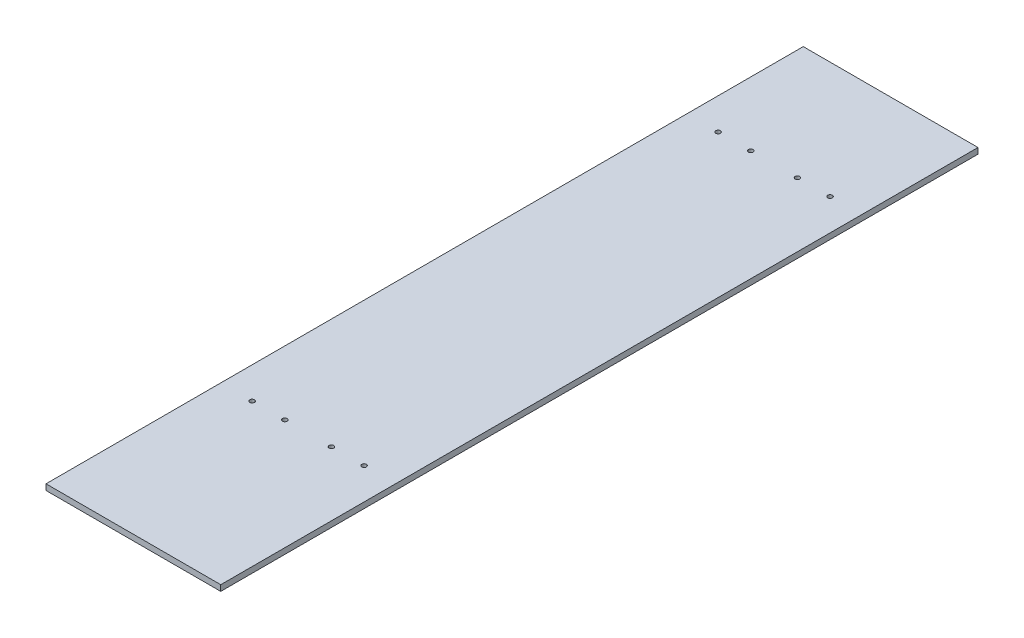
ISO-10303-21;
HEADER;
FILE_DESCRIPTION(('STEP AP214'),'2;1');
FILE_NAME('part.step','',(''),(''),'','','');
FILE_SCHEMA(('AUTOMOTIVE_DESIGN { 1 0 10303 214 1 1 1 1 }'));
ENDSEC;
DATA;
#1=APPLICATION_CONTEXT('core data for automotive mechanical design processes');
#2=APPLICATION_PROTOCOL_DEFINITION('international standard','automotive_design',2000,#1);
#3=PRODUCT_CONTEXT('',#1,'mechanical');
#4=PRODUCT('Part','Part','',(#3));
#5=PRODUCT_RELATED_PRODUCT_CATEGORY('part','',(#4));
#6=PRODUCT_DEFINITION_FORMATION('','',#4);
#7=PRODUCT_DEFINITION_CONTEXT('part definition',#1,'design');
#8=PRODUCT_DEFINITION('design','',#6,#7);
#9=PRODUCT_DEFINITION_SHAPE('','',#8);
#10=(LENGTH_UNIT() NAMED_UNIT(*) SI_UNIT(.MILLI.,.METRE.));
#11=(NAMED_UNIT(*) PLANE_ANGLE_UNIT() SI_UNIT($,.RADIAN.));
#12=(NAMED_UNIT(*) SI_UNIT($,.STERADIAN.) SOLID_ANGLE_UNIT());
#13=UNCERTAINTY_MEASURE_WITH_UNIT(LENGTH_MEASURE(1.E-05),#10,'distance_accuracy_value','');
#14=(GEOMETRIC_REPRESENTATION_CONTEXT(3) GLOBAL_UNCERTAINTY_ASSIGNED_CONTEXT((#13)) GLOBAL_UNIT_ASSIGNED_CONTEXT((#10,
#11,#12)) REPRESENTATION_CONTEXT('',''));
#15=CARTESIAN_POINT('',(0.,0.,0.));
#16=DIRECTION('',(0.,0.,1.));
#17=DIRECTION('',(1.,0.,0.));
#18=AXIS2_PLACEMENT_3D('',#15,#16,#17);
#19=CARTESIAN_POINT('',(-75.,-2.50000000000001,650.));
#20=DIRECTION('',(1.,0.,0.));
#21=DIRECTION('',(0.,0.,-1.));
#22=AXIS2_PLACEMENT_3D('',#19,#20,#21);
#23=PLANE('',#22);
#24=DIRECTION('',(0.,-1.,0.));
#25=VECTOR('',#24,1.);
#26=CARTESIAN_POINT('',(-75.,-2.50000000000001,0.));
#27=LINE('',#26,#25);
#28=CARTESIAN_POINT('',(-75.,2.49999999999999,0.));
#29=VERTEX_POINT('',#28);
#30=CARTESIAN_POINT('',(-75.,-2.50000000000001,0.));
#31=VERTEX_POINT('',#30);
#32=EDGE_CURVE('E107',#29,#31,#27,.T.);
#33=ORIENTED_EDGE('',*,*,#32,.T.);
#34=DIRECTION('',(0.,0.,-1.));
#35=VECTOR('',#34,1.);
#36=CARTESIAN_POINT('',(-75.,-2.50000000000001,650.));
#37=LINE('',#36,#35);
#38=CARTESIAN_POINT('',(-75.,-2.50000000000001,650.));
#39=VERTEX_POINT('',#38);
#40=EDGE_CURVE('E11',#39,#31,#37,.T.);
#41=ORIENTED_EDGE('',*,*,#40,.F.);
#42=DIRECTION('',(0.,-1.,0.));
#43=VECTOR('',#42,1.);
#44=CARTESIAN_POINT('',(-75.,-2.50000000000001,650.));
#45=LINE('',#44,#43);
#46=CARTESIAN_POINT('',(-75.,2.49999999999999,650.));
#47=VERTEX_POINT('',#46);
#48=EDGE_CURVE('E91',#47,#39,#45,.T.);
#49=ORIENTED_EDGE('',*,*,#48,.F.);
#50=DIRECTION('',(0.,0.,-1.));
#51=VECTOR('',#50,1.);
#52=CARTESIAN_POINT('',(-75.,2.49999999999999,650.));
#53=LINE('',#52,#51);
#54=EDGE_CURVE('E103',#47,#29,#53,.T.);
#55=ORIENTED_EDGE('',*,*,#54,.T.);
#56=EDGE_LOOP('',(#33,#41,#49,#55));
#57=FACE_BOUND('',#56,.T.);
#58=ADVANCED_FACE('F39',(#57),#23,.F.);
#59=CARTESIAN_POINT('',(75.,-2.49999999999999,650.));
#60=DIRECTION('',(0.,1.,0.));
#61=DIRECTION('',(-1.,0.,0.));
#62=AXIS2_PLACEMENT_3D('',#59,#60,#61);
#63=PLANE('',#62);
#64=CARTESIAN_POINT('',(48.,-2.49999999999999,100.));
#65=DIRECTION('',(0.,1.,0.));
#66=DIRECTION('',(-1.,0.,0.));
#67=AXIS2_PLACEMENT_3D('',#64,#65,#66);
#68=CIRCLE('',#67,2.);
#69=CARTESIAN_POINT('',(46.,-2.49999999999999,100.));
#70=VERTEX_POINT('',#69);
#71=EDGE_CURVE('E152',#70,#70,#68,.F.);
#72=ORIENTED_EDGE('',*,*,#71,.F.);
#73=EDGE_LOOP('',(#72));
#74=FACE_BOUND('',#73,.T.);
#75=CARTESIAN_POINT('',(20.,-2.5,500.));
#76=DIRECTION('',(0.,1.,0.));
#77=DIRECTION('',(-1.,0.,0.));
#78=AXIS2_PLACEMENT_3D('',#75,#76,#77);
#79=CIRCLE('',#78,2.);
#80=CARTESIAN_POINT('',(18.,-2.5,500.));
#81=VERTEX_POINT('',#80);
#82=EDGE_CURVE('E145',#81,#81,#79,.F.);
#83=ORIENTED_EDGE('',*,*,#82,.F.);
#84=EDGE_LOOP('',(#83));
#85=FACE_BOUND('',#84,.T.);
#86=CARTESIAN_POINT('',(48.,-2.49999999999999,500.));
#87=DIRECTION('',(0.,1.,0.));
#88=DIRECTION('',(-1.,0.,0.));
#89=AXIS2_PLACEMENT_3D('',#86,#87,#88);
#90=CIRCLE('',#89,2.);
#91=CARTESIAN_POINT('',(46.,-2.49999999999999,500.));
#92=VERTEX_POINT('',#91);
#93=EDGE_CURVE('E136',#92,#92,#90,.F.);
#94=ORIENTED_EDGE('',*,*,#93,.F.);
#95=EDGE_LOOP('',(#94));
#96=FACE_BOUND('',#95,.T.);
#97=CARTESIAN_POINT('',(-48.,-2.50000000000001,500.));
#98=DIRECTION('',(0.,1.,0.));
#99=DIRECTION('',(-1.,0.,0.));
#100=AXIS2_PLACEMENT_3D('',#97,#98,#99);
#101=CIRCLE('',#100,2.);
#102=CARTESIAN_POINT('',(-50.,-2.50000000000001,500.));
#103=VERTEX_POINT('',#102);
#104=EDGE_CURVE('E135',#103,#103,#101,.F.);
#105=ORIENTED_EDGE('',*,*,#104,.F.);
#106=EDGE_LOOP('',(#105));
#107=FACE_BOUND('',#106,.T.);
#108=CARTESIAN_POINT('',(20.,-2.5,100.));
#109=DIRECTION('',(0.,1.,0.));
#110=DIRECTION('',(-1.,0.,0.));
#111=AXIS2_PLACEMENT_3D('',#108,#109,#110);
#112=CIRCLE('',#111,2.);
#113=CARTESIAN_POINT('',(18.,-2.5,100.));
#114=VERTEX_POINT('',#113);
#115=EDGE_CURVE('E161',#114,#114,#112,.F.);
#116=ORIENTED_EDGE('',*,*,#115,.F.);
#117=EDGE_LOOP('',(#116));
#118=FACE_BOUND('',#117,.T.);
#119=CARTESIAN_POINT('',(-20.,-2.5,100.));
#120=DIRECTION('',(0.,1.,0.));
#121=DIRECTION('',(-1.,0.,0.));
#122=AXIS2_PLACEMENT_3D('',#119,#120,#121);
#123=CIRCLE('',#122,2.);
#124=CARTESIAN_POINT('',(-22.,-2.5,100.));
#125=VERTEX_POINT('',#124);
#126=EDGE_CURVE('E177',#125,#125,#123,.F.);
#127=ORIENTED_EDGE('',*,*,#126,.F.);
#128=EDGE_LOOP('',(#127));
#129=FACE_BOUND('',#128,.T.);
#130=CARTESIAN_POINT('',(-48.,-2.50000000000001,100.));
#131=DIRECTION('',(0.,1.,0.));
#132=DIRECTION('',(-1.,0.,0.));
#133=AXIS2_PLACEMENT_3D('',#130,#131,#132);
#134=CIRCLE('',#133,2.);
#135=CARTESIAN_POINT('',(-50.,-2.50000000000001,100.));
#136=VERTEX_POINT('',#135);
#137=EDGE_CURVE('E168',#136,#136,#134,.F.);
#138=ORIENTED_EDGE('',*,*,#137,.F.);
#139=EDGE_LOOP('',(#138));
#140=FACE_BOUND('',#139,.T.);
#141=CARTESIAN_POINT('',(-20.,-2.5,500.));
#142=DIRECTION('',(0.,1.,0.));
#143=DIRECTION('',(-1.,0.,0.));
#144=AXIS2_PLACEMENT_3D('',#141,#142,#143);
#145=CIRCLE('',#144,2.);
#146=CARTESIAN_POINT('',(-22.,-2.5,500.));
#147=VERTEX_POINT('',#146);
#148=EDGE_CURVE('E111',#147,#147,#145,.F.);
#149=ORIENTED_EDGE('',*,*,#148,.F.);
#150=EDGE_LOOP('',(#149));
#151=FACE_BOUND('',#150,.T.);
#152=DIRECTION('',(1.,0.,0.));
#153=VECTOR('',#152,1.);
#154=CARTESIAN_POINT('',(75.,-2.49999999999999,0.));
#155=LINE('',#154,#153);
#156=CARTESIAN_POINT('',(75.,-2.49999999999999,0.));
#157=VERTEX_POINT('',#156);
#158=EDGE_CURVE('E96',#31,#157,#155,.T.);
#159=ORIENTED_EDGE('',*,*,#158,.T.);
#160=DIRECTION('',(0.,0.,-1.));
#161=VECTOR('',#160,1.);
#162=CARTESIAN_POINT('',(75.,-2.49999999999999,650.));
#163=LINE('',#162,#161);
#164=CARTESIAN_POINT('',(75.,-2.49999999999999,650.));
#165=VERTEX_POINT('',#164);
#166=EDGE_CURVE('E48',#165,#157,#163,.T.);
#167=ORIENTED_EDGE('',*,*,#166,.F.);
#168=DIRECTION('',(1.,0.,0.));
#169=VECTOR('',#168,1.);
#170=CARTESIAN_POINT('',(75.,-2.49999999999999,650.));
#171=LINE('',#170,#169);
#172=EDGE_CURVE('E86',#39,#165,#171,.T.);
#173=ORIENTED_EDGE('',*,*,#172,.F.);
#174=ORIENTED_EDGE('',*,*,#40,.T.);
#175=EDGE_LOOP('',(#159,#167,#173,#174));
#176=FACE_BOUND('',#175,.T.);
#177=ADVANCED_FACE('F95',(#74,#85,#96,#107,#118,#129,#140,#151,#176),#63,.F.);
#178=CARTESIAN_POINT('',(75.,-2.49999999999999,650.));
#179=DIRECTION('',(-1.,0.,0.));
#180=DIRECTION('',(0.,0.,1.));
#181=AXIS2_PLACEMENT_3D('',#178,#179,#180);
#182=PLANE('',#181);
#183=DIRECTION('',(0.,1.,0.));
#184=VECTOR('',#183,1.);
#185=CARTESIAN_POINT('',(75.,-2.49999999999999,0.));
#186=LINE('',#185,#184);
#187=CARTESIAN_POINT('',(75.,2.50000000000001,0.));
#188=VERTEX_POINT('',#187);
#189=EDGE_CURVE('E73',#157,#188,#186,.T.);
#190=ORIENTED_EDGE('',*,*,#189,.T.);
#191=DIRECTION('',(0.,0.,-1.));
#192=VECTOR('',#191,1.);
#193=CARTESIAN_POINT('',(75.,2.50000000000001,650.));
#194=LINE('',#193,#192);
#195=CARTESIAN_POINT('',(75.,2.50000000000001,650.));
#196=VERTEX_POINT('',#195);
#197=EDGE_CURVE('E98',#196,#188,#194,.T.);
#198=ORIENTED_EDGE('',*,*,#197,.F.);
#199=DIRECTION('',(0.,1.,0.));
#200=VECTOR('',#199,1.);
#201=CARTESIAN_POINT('',(75.,-2.49999999999999,650.));
#202=LINE('',#201,#200);
#203=EDGE_CURVE('E89',#165,#196,#202,.T.);
#204=ORIENTED_EDGE('',*,*,#203,.F.);
#205=ORIENTED_EDGE('',*,*,#166,.T.);
#206=EDGE_LOOP('',(#190,#198,#204,#205));
#207=FACE_BOUND('',#206,.T.);
#208=ADVANCED_FACE('F99',(#207),#182,.F.);
#209=CARTESIAN_POINT('',(75.,2.50000000000001,650.));
#210=DIRECTION('',(0.,-1.,0.));
#211=DIRECTION('',(1.,0.,0.));
#212=AXIS2_PLACEMENT_3D('',#209,#210,#211);
#213=PLANE('',#212);
#214=CARTESIAN_POINT('',(48.,2.50000000000001,100.));
#215=DIRECTION('',(0.,1.,0.));
#216=DIRECTION('',(-1.,0.,0.));
#217=AXIS2_PLACEMENT_3D('',#214,#215,#216);
#218=CIRCLE('',#217,2.);
#219=CARTESIAN_POINT('',(46.,2.50000000000001,100.));
#220=VERTEX_POINT('',#219);
#221=EDGE_CURVE('E157',#220,#220,#218,.T.);
#222=ORIENTED_EDGE('',*,*,#221,.F.);
#223=EDGE_LOOP('',(#222));
#224=FACE_BOUND('',#223,.T.);
#225=CARTESIAN_POINT('',(20.,2.5,500.));
#226=DIRECTION('',(0.,1.,0.));
#227=DIRECTION('',(1.,0.,0.));
#228=AXIS2_PLACEMENT_3D('',#225,#226,#227);
#229=CIRCLE('',#228,2.);
#230=CARTESIAN_POINT('',(22.,2.5,500.));
#231=VERTEX_POINT('',#230);
#232=EDGE_CURVE('E156',#231,#231,#229,.T.);
#233=ORIENTED_EDGE('',*,*,#232,.F.);
#234=EDGE_LOOP('',(#233));
#235=FACE_BOUND('',#234,.T.);
#236=CARTESIAN_POINT('',(48.,2.50000000000001,500.));
#237=DIRECTION('',(0.,1.,0.));
#238=DIRECTION('',(1.,0.,0.));
#239=AXIS2_PLACEMENT_3D('',#236,#237,#238);
#240=CIRCLE('',#239,2.);
#241=CARTESIAN_POINT('',(50.,2.50000000000001,500.));
#242=VERTEX_POINT('',#241);
#243=EDGE_CURVE('E141',#242,#242,#240,.T.);
#244=ORIENTED_EDGE('',*,*,#243,.F.);
#245=EDGE_LOOP('',(#244));
#246=FACE_BOUND('',#245,.T.);
#247=CARTESIAN_POINT('',(-48.,2.49999999999999,500.));
#248=DIRECTION('',(0.,1.,0.));
#249=DIRECTION('',(-1.,0.,0.));
#250=AXIS2_PLACEMENT_3D('',#247,#248,#249);
#251=CIRCLE('',#250,2.);
#252=CARTESIAN_POINT('',(-50.,2.49999999999999,500.));
#253=VERTEX_POINT('',#252);
#254=EDGE_CURVE('E140',#253,#253,#251,.T.);
#255=ORIENTED_EDGE('',*,*,#254,.F.);
#256=EDGE_LOOP('',(#255));
#257=FACE_BOUND('',#256,.T.);
#258=CARTESIAN_POINT('',(20.,2.5,100.));
#259=DIRECTION('',(0.,1.,0.));
#260=DIRECTION('',(-1.,0.,0.));
#261=AXIS2_PLACEMENT_3D('',#258,#259,#260);
#262=CIRCLE('',#261,2.);
#263=CARTESIAN_POINT('',(18.,2.5,100.));
#264=VERTEX_POINT('',#263);
#265=EDGE_CURVE('E181',#264,#264,#262,.T.);
#266=ORIENTED_EDGE('',*,*,#265,.F.);
#267=EDGE_LOOP('',(#266));
#268=FACE_BOUND('',#267,.T.);
#269=CARTESIAN_POINT('',(-20.,2.5,100.));
#270=DIRECTION('',(0.,1.,0.));
#271=DIRECTION('',(1.,0.,0.));
#272=AXIS2_PLACEMENT_3D('',#269,#270,#271);
#273=CIRCLE('',#272,2.);
#274=CARTESIAN_POINT('',(-18.,2.5,100.));
#275=VERTEX_POINT('',#274);
#276=EDGE_CURVE('E172',#275,#275,#273,.T.);
#277=ORIENTED_EDGE('',*,*,#276,.F.);
#278=EDGE_LOOP('',(#277));
#279=FACE_BOUND('',#278,.T.);
#280=CARTESIAN_POINT('',(-48.,2.49999999999999,100.));
#281=DIRECTION('',(0.,1.,0.));
#282=DIRECTION('',(1.,0.,0.));
#283=AXIS2_PLACEMENT_3D('',#280,#281,#282);
#284=CIRCLE('',#283,2.);
#285=CARTESIAN_POINT('',(-46.,2.5,100.));
#286=VERTEX_POINT('',#285);
#287=EDGE_CURVE('E173',#286,#286,#284,.T.);
#288=ORIENTED_EDGE('',*,*,#287,.F.);
#289=EDGE_LOOP('',(#288));
#290=FACE_BOUND('',#289,.T.);
#291=CARTESIAN_POINT('',(-20.,2.5,500.));
#292=DIRECTION('',(0.,1.,0.));
#293=DIRECTION('',(-1.,0.,0.));
#294=AXIS2_PLACEMENT_3D('',#291,#292,#293);
#295=CIRCLE('',#294,2.);
#296=CARTESIAN_POINT('',(-22.,2.5,500.));
#297=VERTEX_POINT('',#296);
#298=EDGE_CURVE('E131',#297,#297,#295,.T.);
#299=ORIENTED_EDGE('',*,*,#298,.F.);
#300=EDGE_LOOP('',(#299));
#301=FACE_BOUND('',#300,.T.);
#302=DIRECTION('',(-1.,0.,0.));
#303=VECTOR('',#302,1.);
#304=CARTESIAN_POINT('',(75.,2.50000000000001,0.));
#305=LINE('',#304,#303);
#306=EDGE_CURVE('E79',#188,#29,#305,.T.);
#307=ORIENTED_EDGE('',*,*,#306,.T.);
#308=ORIENTED_EDGE('',*,*,#54,.F.);
#309=DIRECTION('',(-1.,0.,0.));
#310=VECTOR('',#309,1.);
#311=CARTESIAN_POINT('',(75.,2.50000000000001,650.));
#312=LINE('',#311,#310);
#313=EDGE_CURVE('E56',#196,#47,#312,.T.);
#314=ORIENTED_EDGE('',*,*,#313,.F.);
#315=ORIENTED_EDGE('',*,*,#197,.T.);
#316=EDGE_LOOP('',(#307,#308,#314,#315));
#317=FACE_BOUND('',#316,.T.);
#318=ADVANCED_FACE('F121',(#224,#235,#246,#257,#268,#279,#290,#301,#317),#213,.F.);
#319=CARTESIAN_POINT('',(0.,0.,650.));
#320=DIRECTION('',(0.,0.,1.));
#321=DIRECTION('',(1.,0.,0.));
#322=AXIS2_PLACEMENT_3D('',#319,#320,#321);
#323=PLANE('',#322);
#324=ORIENTED_EDGE('',*,*,#48,.T.);
#325=ORIENTED_EDGE('',*,*,#172,.T.);
#326=ORIENTED_EDGE('',*,*,#203,.T.);
#327=ORIENTED_EDGE('',*,*,#313,.T.);
#328=EDGE_LOOP('',(#324,#325,#326,#327));
#329=FACE_BOUND('',#328,.T.);
#330=ADVANCED_FACE('F87',(#329),#323,.T.);
#331=CARTESIAN_POINT('',(0.,0.,0.));
#332=DIRECTION('',(0.,0.,1.));
#333=DIRECTION('',(1.,0.,0.));
#334=AXIS2_PLACEMENT_3D('',#331,#332,#333);
#335=PLANE('',#334);
#336=ORIENTED_EDGE('',*,*,#32,.F.);
#337=ORIENTED_EDGE('',*,*,#306,.F.);
#338=ORIENTED_EDGE('',*,*,#189,.F.);
#339=ORIENTED_EDGE('',*,*,#158,.F.);
#340=EDGE_LOOP('',(#336,#337,#338,#339));
#341=FACE_BOUND('',#340,.T.);
#342=ADVANCED_FACE('F124',(#341),#335,.F.);
#343=CARTESIAN_POINT('',(-20.,-2.50100000000002,500.));
#344=DIRECTION('',(0.,1.,0.));
#345=DIRECTION('',(-1.,0.,0.));
#346=AXIS2_PLACEMENT_3D('',#343,#344,#345);
#347=CYLINDRICAL_SURFACE('',#346,2.);
#348=ORIENTED_EDGE('',*,*,#298,.T.);
#349=EDGE_LOOP('',(#348));
#350=FACE_BOUND('',#349,.T.);
#351=ORIENTED_EDGE('',*,*,#148,.T.);
#352=EDGE_LOOP('',(#351));
#353=FACE_BOUND('',#352,.T.);
#354=ADVANCED_FACE('F205',(#350,#353),#347,.F.);
#355=CARTESIAN_POINT('',(-48.,-2.50100000000002,100.));
#356=DIRECTION('',(0.,1.,0.));
#357=DIRECTION('',(-1.,0.,0.));
#358=AXIS2_PLACEMENT_3D('',#355,#356,#357);
#359=CYLINDRICAL_SURFACE('',#358,2.);
#360=ORIENTED_EDGE('',*,*,#287,.T.);
#361=EDGE_LOOP('',(#360));
#362=FACE_BOUND('',#361,.T.);
#363=ORIENTED_EDGE('',*,*,#137,.T.);
#364=EDGE_LOOP('',(#363));
#365=FACE_BOUND('',#364,.T.);
#366=ADVANCED_FACE('F208',(#362,#365),#359,.F.);
#367=CARTESIAN_POINT('',(-20.,-2.50100000000002,100.));
#368=DIRECTION('',(0.,1.,0.));
#369=DIRECTION('',(-1.,0.,0.));
#370=AXIS2_PLACEMENT_3D('',#367,#368,#369);
#371=CYLINDRICAL_SURFACE('',#370,2.);
#372=ORIENTED_EDGE('',*,*,#276,.T.);
#373=EDGE_LOOP('',(#372));
#374=FACE_BOUND('',#373,.T.);
#375=ORIENTED_EDGE('',*,*,#126,.T.);
#376=EDGE_LOOP('',(#375));
#377=FACE_BOUND('',#376,.T.);
#378=ADVANCED_FACE('F244',(#374,#377),#371,.F.);
#379=CARTESIAN_POINT('',(20.,-2.50100000000002,100.));
#380=DIRECTION('',(0.,1.,0.));
#381=DIRECTION('',(-1.,0.,0.));
#382=AXIS2_PLACEMENT_3D('',#379,#380,#381);
#383=CYLINDRICAL_SURFACE('',#382,2.);
#384=ORIENTED_EDGE('',*,*,#265,.T.);
#385=EDGE_LOOP('',(#384));
#386=FACE_BOUND('',#385,.T.);
#387=ORIENTED_EDGE('',*,*,#115,.T.);
#388=EDGE_LOOP('',(#387));
#389=FACE_BOUND('',#388,.T.);
#390=ADVANCED_FACE('F192',(#386,#389),#383,.F.);
#391=CARTESIAN_POINT('',(-48.,-2.50100000000002,500.));
#392=DIRECTION('',(0.,1.,0.));
#393=DIRECTION('',(-1.,0.,0.));
#394=AXIS2_PLACEMENT_3D('',#391,#392,#393);
#395=CYLINDRICAL_SURFACE('',#394,2.);
#396=ORIENTED_EDGE('',*,*,#254,.T.);
#397=EDGE_LOOP('',(#396));
#398=FACE_BOUND('',#397,.T.);
#399=ORIENTED_EDGE('',*,*,#104,.T.);
#400=EDGE_LOOP('',(#399));
#401=FACE_BOUND('',#400,.T.);
#402=ADVANCED_FACE('F230',(#398,#401),#395,.F.);
#403=CARTESIAN_POINT('',(48.,-2.50100000000001,500.));
#404=DIRECTION('',(0.,1.,0.));
#405=DIRECTION('',(-1.,0.,0.));
#406=AXIS2_PLACEMENT_3D('',#403,#404,#405);
#407=CYLINDRICAL_SURFACE('',#406,2.);
#408=ORIENTED_EDGE('',*,*,#243,.T.);
#409=EDGE_LOOP('',(#408));
#410=FACE_BOUND('',#409,.T.);
#411=ORIENTED_EDGE('',*,*,#93,.T.);
#412=EDGE_LOOP('',(#411));
#413=FACE_BOUND('',#412,.T.);
#414=ADVANCED_FACE('F226',(#410,#413),#407,.F.);
#415=CARTESIAN_POINT('',(20.,-2.50100000000002,500.));
#416=DIRECTION('',(0.,1.,0.));
#417=DIRECTION('',(-1.,0.,0.));
#418=AXIS2_PLACEMENT_3D('',#415,#416,#417);
#419=CYLINDRICAL_SURFACE('',#418,2.);
#420=ORIENTED_EDGE('',*,*,#232,.T.);
#421=EDGE_LOOP('',(#420));
#422=FACE_BOUND('',#421,.T.);
#423=ORIENTED_EDGE('',*,*,#82,.T.);
#424=EDGE_LOOP('',(#423));
#425=FACE_BOUND('',#424,.T.);
#426=ADVANCED_FACE('F229',(#422,#425),#419,.F.);
#427=CARTESIAN_POINT('',(48.,-2.50100000000001,100.));
#428=DIRECTION('',(0.,1.,0.));
#429=DIRECTION('',(-1.,0.,0.));
#430=AXIS2_PLACEMENT_3D('',#427,#428,#429);
#431=CYLINDRICAL_SURFACE('',#430,2.);
#432=ORIENTED_EDGE('',*,*,#221,.T.);
#433=EDGE_LOOP('',(#432));
#434=FACE_BOUND('',#433,.T.);
#435=ORIENTED_EDGE('',*,*,#71,.T.);
#436=EDGE_LOOP('',(#435));
#437=FACE_BOUND('',#436,.T.);
#438=ADVANCED_FACE('F235',(#434,#437),#431,.F.);
#439=CLOSED_SHELL('',(#58,#177,#208,#318,#330,#342,#354,#366,#378,#390,#402,#414,#426,#438));
#440=MANIFOLD_SOLID_BREP('B2',#439);
#441=ADVANCED_BREP_SHAPE_REPRESENTATION('',(#18,#440),#14);
#442=SHAPE_DEFINITION_REPRESENTATION(#9,#441);
ENDSEC;
END-ISO-10303-21;
